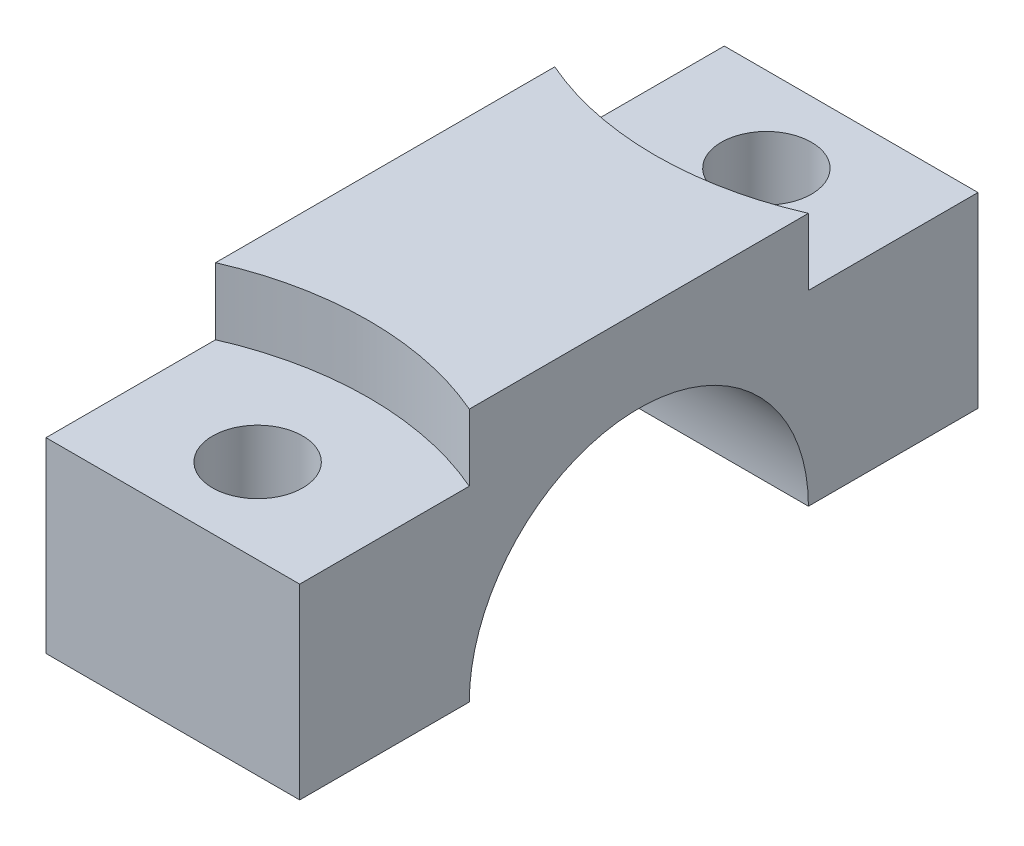
ISO-10303-21;
HEADER;
FILE_DESCRIPTION(('STEP AP214'),'2;1');
FILE_NAME('part.step','',(''),(''),'','','');
FILE_SCHEMA(('AUTOMOTIVE_DESIGN { 1 0 10303 214 1 1 1 1 }'));
ENDSEC;
DATA;
#1=APPLICATION_CONTEXT('core data for automotive mechanical design processes');
#2=APPLICATION_PROTOCOL_DEFINITION('international standard','automotive_design',2000,#1);
#3=PRODUCT_CONTEXT('',#1,'mechanical');
#4=PRODUCT('Part','Part','',(#3));
#5=PRODUCT_RELATED_PRODUCT_CATEGORY('part','',(#4));
#6=PRODUCT_DEFINITION_FORMATION('','',#4);
#7=PRODUCT_DEFINITION_CONTEXT('part definition',#1,'design');
#8=PRODUCT_DEFINITION('design','',#6,#7);
#9=PRODUCT_DEFINITION_SHAPE('','',#8);
#10=(LENGTH_UNIT() NAMED_UNIT(*) SI_UNIT(.MILLI.,.METRE.));
#11=(NAMED_UNIT(*) PLANE_ANGLE_UNIT() SI_UNIT($,.RADIAN.));
#12=(NAMED_UNIT(*) SI_UNIT($,.STERADIAN.) SOLID_ANGLE_UNIT());
#13=UNCERTAINTY_MEASURE_WITH_UNIT(LENGTH_MEASURE(1.E-05),#10,'distance_accuracy_value','');
#14=(GEOMETRIC_REPRESENTATION_CONTEXT(3) GLOBAL_UNCERTAINTY_ASSIGNED_CONTEXT((#13)) GLOBAL_UNIT_ASSIGNED_CONTEXT((#10,
#11,#12)) REPRESENTATION_CONTEXT('',''));
#15=CARTESIAN_POINT('',(0.,0.,0.));
#16=DIRECTION('',(0.,0.,1.));
#17=DIRECTION('',(1.,0.,0.));
#18=AXIS2_PLACEMENT_3D('',#15,#16,#17);
#19=CARTESIAN_POINT('',(0.,-14.,0.));
#20=DIRECTION('',(0.,1.,0.));
#21=DIRECTION('',(0.,0.,1.));
#22=AXIS2_PLACEMENT_3D('',#19,#20,#21);
#23=PLANE('',#22);
#24=CARTESIAN_POINT('',(9.50000000000001,-14.,-6.35));
#25=DIRECTION('',(0.,1.,0.));
#26=DIRECTION('',(0.,0.,1.));
#27=AXIS2_PLACEMENT_3D('',#24,#25,#26);
#28=CIRCLE('',#27,3.375);
#29=CARTESIAN_POINT('',(9.50000000000001,-14.,-2.975));
#30=VERTEX_POINT('',#29);
#31=EDGE_CURVE('E244',#30,#30,#28,.T.);
#32=ORIENTED_EDGE('',*,*,#31,.T.);
#33=EDGE_LOOP('',(#32));
#34=FACE_BOUND('',#33,.T.);
#35=DIRECTION('',(0.,0.,-1.));
#36=VECTOR('',#35,1.);
#37=CARTESIAN_POINT('',(0.,-14.,0.));
#38=LINE('',#37,#36);
#39=CARTESIAN_POINT('',(0.,-14.,0.));
#40=VERTEX_POINT('',#39);
#41=CARTESIAN_POINT('',(0.,-14.,-12.7));
#42=VERTEX_POINT('',#41);
#43=EDGE_CURVE('E208',#40,#42,#38,.T.);
#44=ORIENTED_EDGE('',*,*,#43,.T.);
#45=DIRECTION('',(1.,0.,0.));
#46=VECTOR('',#45,1.);
#47=CARTESIAN_POINT('',(0.,-14.,-12.7));
#48=LINE('',#47,#46);
#49=CARTESIAN_POINT('',(19.,-14.,-12.7));
#50=VERTEX_POINT('',#49);
#51=EDGE_CURVE('E12',#42,#50,#48,.T.);
#52=ORIENTED_EDGE('',*,*,#51,.T.);
#53=DIRECTION('',(0.,0.,-1.));
#54=VECTOR('',#53,1.);
#55=CARTESIAN_POINT('',(19.,-14.,0.));
#56=LINE('',#55,#54);
#57=CARTESIAN_POINT('',(19.,-14.,0.));
#58=VERTEX_POINT('',#57);
#59=EDGE_CURVE('E200',#58,#50,#56,.T.);
#60=ORIENTED_EDGE('',*,*,#59,.F.);
#61=DIRECTION('',(1.,0.,0.));
#62=VECTOR('',#61,1.);
#63=CARTESIAN_POINT('',(0.,-14.,0.));
#64=LINE('',#63,#62);
#65=EDGE_CURVE('E254',#40,#58,#64,.T.);
#66=ORIENTED_EDGE('',*,*,#65,.F.);
#67=EDGE_LOOP('',(#44,#52,#60,#66));
#68=FACE_BOUND('',#67,.T.);
#69=ADVANCED_FACE('F110',(#34,#68),#23,.F.);
#70=CARTESIAN_POINT('',(0.,0.,0.));
#71=DIRECTION('',(0.,1.,0.));
#72=DIRECTION('',(0.,0.,1.));
#73=AXIS2_PLACEMENT_3D('',#70,#71,#72);
#74=PLANE('',#73);
#75=CARTESIAN_POINT('',(9.50000000000001,0.,-6.35));
#76=DIRECTION('',(0.,1.,0.));
#77=DIRECTION('',(0.,0.,1.));
#78=AXIS2_PLACEMENT_3D('',#75,#76,#77);
#79=CIRCLE('',#78,3.375);
#80=CARTESIAN_POINT('',(9.50000000000001,0.,-2.975));
#81=VERTEX_POINT('',#80);
#82=EDGE_CURVE('E249',#81,#81,#79,.T.);
#83=ORIENTED_EDGE('',*,*,#82,.F.);
#84=EDGE_LOOP('',(#83));
#85=FACE_BOUND('',#84,.T.);
#86=CARTESIAN_POINT('',(9.5,0.,9.1108711426206));
#87=DIRECTION('',(0.,1.,0.));
#88=DIRECTION('',(0.,0.,1.));
#89=AXIS2_PLACEMENT_3D('',#86,#87,#88);
#90=CIRCLE('',#89,23.79);
#91=CARTESIAN_POINT('',(0.,0.,-12.7));
#92=VERTEX_POINT('',#91);
#93=CARTESIAN_POINT('',(19.,0.,-12.7));
#94=VERTEX_POINT('',#93);
#95=EDGE_CURVE('E274',#92,#94,#90,.F.);
#96=ORIENTED_EDGE('',*,*,#95,.F.);
#97=DIRECTION('',(0.,0.,-1.));
#98=VECTOR('',#97,1.);
#99=CARTESIAN_POINT('',(0.,0.,0.));
#100=LINE('',#99,#98);
#101=CARTESIAN_POINT('',(0.,0.,0.));
#102=VERTEX_POINT('',#101);
#103=EDGE_CURVE('E226',#102,#92,#100,.T.);
#104=ORIENTED_EDGE('',*,*,#103,.F.);
#105=DIRECTION('',(1.,0.,0.));
#106=VECTOR('',#105,1.);
#107=CARTESIAN_POINT('',(0.,0.,0.));
#108=LINE('',#107,#106);
#109=CARTESIAN_POINT('',(19.,0.,0.));
#110=VERTEX_POINT('',#109);
#111=EDGE_CURVE('E248',#102,#110,#108,.T.);
#112=ORIENTED_EDGE('',*,*,#111,.T.);
#113=DIRECTION('',(0.,0.,-1.));
#114=VECTOR('',#113,1.);
#115=CARTESIAN_POINT('',(19.,0.,0.));
#116=LINE('',#115,#114);
#117=EDGE_CURVE('E231',#110,#94,#116,.T.);
#118=ORIENTED_EDGE('',*,*,#117,.T.);
#119=EDGE_LOOP('',(#96,#104,#112,#118));
#120=FACE_BOUND('',#119,.T.);
#121=ADVANCED_FACE('F272',(#85,#120),#74,.T.);
#122=CARTESIAN_POINT('',(9.50000000000001,0.,-44.45));
#123=DIRECTION('',(0.,1.,0.));
#124=DIRECTION('',(0.,0.,1.));
#125=AXIS2_PLACEMENT_3D('',#122,#123,#124);
#126=CIRCLE('',#125,3.375);
#127=CARTESIAN_POINT('',(9.50000000000001,0.,-41.075));
#128=VERTEX_POINT('',#127);
#129=EDGE_CURVE('E220',#128,#128,#126,.T.);
#130=ORIENTED_EDGE('',*,*,#129,.F.);
#131=EDGE_LOOP('',(#130));
#132=FACE_BOUND('',#131,.T.);
#133=CARTESIAN_POINT('',(0.,0.,-38.1));
#134=VERTEX_POINT('',#133);
#135=CARTESIAN_POINT('',(0.,0.,-50.8));
#136=VERTEX_POINT('',#135);
#137=EDGE_CURVE('E224',#134,#136,#100,.T.);
#138=ORIENTED_EDGE('',*,*,#137,.F.);
#139=CARTESIAN_POINT('',(9.5,0.,-59.9108711426206));
#140=DIRECTION('',(0.,1.,0.));
#141=DIRECTION('',(0.,0.,1.));
#142=AXIS2_PLACEMENT_3D('',#139,#140,#141);
#143=CIRCLE('',#142,23.79);
#144=CARTESIAN_POINT('',(19.,0.,-38.1));
#145=VERTEX_POINT('',#144);
#146=EDGE_CURVE('E134',#134,#145,#143,.T.);
#147=ORIENTED_EDGE('',*,*,#146,.T.);
#148=CARTESIAN_POINT('',(19.,0.,-50.8));
#149=VERTEX_POINT('',#148);
#150=EDGE_CURVE('E230',#145,#149,#116,.T.);
#151=ORIENTED_EDGE('',*,*,#150,.T.);
#152=DIRECTION('',(1.,0.,0.));
#153=VECTOR('',#152,1.);
#154=CARTESIAN_POINT('',(0.,0.,-50.8));
#155=LINE('',#154,#153);
#156=EDGE_CURVE('E234',#136,#149,#155,.T.);
#157=ORIENTED_EDGE('',*,*,#156,.F.);
#158=EDGE_LOOP('',(#138,#147,#151,#157));
#159=FACE_BOUND('',#158,.T.);
#160=ADVANCED_FACE('F323',(#132,#159),#74,.T.);
#161=CARTESIAN_POINT('',(9.50000000000001,-14.,-44.45));
#162=DIRECTION('',(0.,1.,0.));
#163=DIRECTION('',(0.,0.,1.));
#164=AXIS2_PLACEMENT_3D('',#161,#162,#163);
#165=CYLINDRICAL_SURFACE('',#164,3.375);
#166=CARTESIAN_POINT('',(9.50000000000001,-14.,-44.45));
#167=DIRECTION('',(0.,1.,0.));
#168=DIRECTION('',(0.,0.,1.));
#169=AXIS2_PLACEMENT_3D('',#166,#167,#168);
#170=CIRCLE('',#169,3.375);
#171=CARTESIAN_POINT('',(9.50000000000001,-14.,-41.075));
#172=VERTEX_POINT('',#171);
#173=EDGE_CURVE('E238',#172,#172,#170,.T.);
#174=ORIENTED_EDGE('',*,*,#173,.F.);
#175=EDGE_LOOP('',(#174));
#176=FACE_BOUND('',#175,.T.);
#177=ORIENTED_EDGE('',*,*,#129,.T.);
#178=EDGE_LOOP('',(#177));
#179=FACE_BOUND('',#178,.T.);
#180=ADVANCED_FACE('F354',(#176,#179),#165,.F.);
#181=CARTESIAN_POINT('',(0.,-14.,0.));
#182=DIRECTION('',(1.,0.,0.));
#183=DIRECTION('',(0.,0.,-1.));
#184=AXIS2_PLACEMENT_3D('',#181,#182,#183);
#185=PLANE('',#184);
#186=CARTESIAN_POINT('',(0.,-14.,-38.1));
#187=VERTEX_POINT('',#186);
#188=CARTESIAN_POINT('',(0.,-14.,-50.8));
#189=VERTEX_POINT('',#188);
#190=EDGE_CURVE('E213',#187,#189,#38,.T.);
#191=ORIENTED_EDGE('',*,*,#190,.F.);
#192=CARTESIAN_POINT('',(0.,-14.,-25.4));
#193=DIRECTION('',(1.,0.,0.));
#194=DIRECTION('',(0.,0.,-1.));
#195=AXIS2_PLACEMENT_3D('',#192,#193,#194);
#196=CIRCLE('',#195,12.7);
#197=EDGE_CURVE('E126',#187,#42,#196,.T.);
#198=ORIENTED_EDGE('',*,*,#197,.T.);
#199=ORIENTED_EDGE('',*,*,#43,.F.);
#200=DIRECTION('',(0.,1.,0.));
#201=VECTOR('',#200,1.);
#202=CARTESIAN_POINT('',(0.,-14.,0.));
#203=LINE('',#202,#201);
#204=EDGE_CURVE('E258',#40,#102,#203,.T.);
#205=ORIENTED_EDGE('',*,*,#204,.T.);
#206=ORIENTED_EDGE('',*,*,#103,.T.);
#207=DIRECTION('',(0.,-1.,0.));
#208=VECTOR('',#207,1.);
#209=CARTESIAN_POINT('',(0.,5.,-12.7));
#210=LINE('',#209,#208);
#211=CARTESIAN_POINT('',(0.,5.,-12.7));
#212=VERTEX_POINT('',#211);
#213=EDGE_CURVE('E253',#212,#92,#210,.T.);
#214=ORIENTED_EDGE('',*,*,#213,.F.);
#215=DIRECTION('',(0.,0.,-1.));
#216=VECTOR('',#215,1.);
#217=CARTESIAN_POINT('',(0.,5.,0.));
#218=LINE('',#217,#216);
#219=CARTESIAN_POINT('',(0.,5.,-38.1));
#220=VERTEX_POINT('',#219);
#221=EDGE_CURVE('E285',#212,#220,#218,.T.);
#222=ORIENTED_EDGE('',*,*,#221,.T.);
#223=DIRECTION('',(0.,-1.,0.));
#224=VECTOR('',#223,1.);
#225=CARTESIAN_POINT('',(0.,5.,-38.1));
#226=LINE('',#225,#224);
#227=EDGE_CURVE('E298',#220,#134,#226,.T.);
#228=ORIENTED_EDGE('',*,*,#227,.T.);
#229=ORIENTED_EDGE('',*,*,#137,.T.);
#230=DIRECTION('',(0.,1.,0.));
#231=VECTOR('',#230,1.);
#232=CARTESIAN_POINT('',(0.,-14.,-50.8));
#233=LINE('',#232,#231);
#234=EDGE_CURVE('E192',#189,#136,#233,.T.);
#235=ORIENTED_EDGE('',*,*,#234,.F.);
#236=EDGE_LOOP('',(#191,#198,#199,#205,#206,#214,#222,#228,#229,#235));
#237=FACE_BOUND('',#236,.T.);
#238=ADVANCED_FACE('F277',(#237),#185,.F.);
#239=CARTESIAN_POINT('',(19.,-14.,0.));
#240=DIRECTION('',(1.,0.,0.));
#241=DIRECTION('',(0.,0.,-1.));
#242=AXIS2_PLACEMENT_3D('',#239,#240,#241);
#243=PLANE('',#242);
#244=CARTESIAN_POINT('',(19.,-14.,-25.4));
#245=DIRECTION('',(1.,0.,0.));
#246=DIRECTION('',(0.,0.,-1.));
#247=AXIS2_PLACEMENT_3D('',#244,#245,#246);
#248=CIRCLE('',#247,12.7);
#249=CARTESIAN_POINT('',(19.,-14.,-38.1));
#250=VERTEX_POINT('',#249);
#251=EDGE_CURVE('E187',#250,#50,#248,.T.);
#252=ORIENTED_EDGE('',*,*,#251,.F.);
#253=CARTESIAN_POINT('',(19.,-14.,-50.8));
#254=VERTEX_POINT('',#253);
#255=EDGE_CURVE('E197',#250,#254,#56,.T.);
#256=ORIENTED_EDGE('',*,*,#255,.T.);
#257=DIRECTION('',(0.,1.,0.));
#258=VECTOR('',#257,1.);
#259=CARTESIAN_POINT('',(19.,-14.,-50.8));
#260=LINE('',#259,#258);
#261=EDGE_CURVE('E219',#254,#149,#260,.T.);
#262=ORIENTED_EDGE('',*,*,#261,.T.);
#263=ORIENTED_EDGE('',*,*,#150,.F.);
#264=DIRECTION('',(0.,-1.,0.));
#265=VECTOR('',#264,1.);
#266=CARTESIAN_POINT('',(19.,5.,-38.1));
#267=LINE('',#266,#265);
#268=CARTESIAN_POINT('',(19.,5.,-38.1));
#269=VERTEX_POINT('',#268);
#270=EDGE_CURVE('E305',#269,#145,#267,.T.);
#271=ORIENTED_EDGE('',*,*,#270,.F.);
#272=DIRECTION('',(0.,0.,-1.));
#273=VECTOR('',#272,1.);
#274=CARTESIAN_POINT('',(19.,5.,0.));
#275=LINE('',#274,#273);
#276=CARTESIAN_POINT('',(19.,5.,-12.7));
#277=VERTEX_POINT('',#276);
#278=EDGE_CURVE('E292',#277,#269,#275,.T.);
#279=ORIENTED_EDGE('',*,*,#278,.F.);
#280=DIRECTION('',(0.,-1.,0.));
#281=VECTOR('',#280,1.);
#282=CARTESIAN_POINT('',(19.,5.,-12.7));
#283=LINE('',#282,#281);
#284=EDGE_CURVE('E309',#277,#94,#283,.T.);
#285=ORIENTED_EDGE('',*,*,#284,.T.);
#286=ORIENTED_EDGE('',*,*,#117,.F.);
#287=DIRECTION('',(0.,1.,0.));
#288=VECTOR('',#287,1.);
#289=CARTESIAN_POINT('',(19.,-14.,0.));
#290=LINE('',#289,#288);
#291=EDGE_CURVE('E225',#58,#110,#290,.T.);
#292=ORIENTED_EDGE('',*,*,#291,.F.);
#293=ORIENTED_EDGE('',*,*,#59,.T.);
#294=EDGE_LOOP('',(#252,#256,#262,#263,#271,#279,#285,#286,#292,#293));
#295=FACE_BOUND('',#294,.T.);
#296=ADVANCED_FACE('F195',(#295),#243,.T.);
#297=CARTESIAN_POINT('',(0.,-14.,-50.8));
#298=DIRECTION('',(0.,0.,1.));
#299=DIRECTION('',(1.,0.,0.));
#300=AXIS2_PLACEMENT_3D('',#297,#298,#299);
#301=PLANE('',#300);
#302=ORIENTED_EDGE('',*,*,#156,.T.);
#303=ORIENTED_EDGE('',*,*,#261,.F.);
#304=DIRECTION('',(1.,0.,0.));
#305=VECTOR('',#304,1.);
#306=CARTESIAN_POINT('',(0.,-14.,-50.8));
#307=LINE('',#306,#305);
#308=EDGE_CURVE('E205',#189,#254,#307,.T.);
#309=ORIENTED_EDGE('',*,*,#308,.F.);
#310=ORIENTED_EDGE('',*,*,#234,.T.);
#311=EDGE_LOOP('',(#302,#303,#309,#310));
#312=FACE_BOUND('',#311,.T.);
#313=ADVANCED_FACE('F320',(#312),#301,.F.);
#314=ORIENTED_EDGE('',*,*,#173,.T.);
#315=EDGE_LOOP('',(#314));
#316=FACE_BOUND('',#315,.T.);
#317=ORIENTED_EDGE('',*,*,#255,.F.);
#318=DIRECTION('',(1.,0.,0.));
#319=VECTOR('',#318,1.);
#320=CARTESIAN_POINT('',(0.,-14.,-38.1));
#321=LINE('',#320,#319);
#322=EDGE_CURVE('E119',#250,#187,#321,.F.);
#323=ORIENTED_EDGE('',*,*,#322,.T.);
#324=ORIENTED_EDGE('',*,*,#190,.T.);
#325=ORIENTED_EDGE('',*,*,#308,.T.);
#326=EDGE_LOOP('',(#317,#323,#324,#325));
#327=FACE_BOUND('',#326,.T.);
#328=ADVANCED_FACE('F203',(#316,#327),#23,.F.);
#329=CARTESIAN_POINT('',(0.,-14.,0.));
#330=DIRECTION('',(0.,0.,1.));
#331=DIRECTION('',(1.,0.,0.));
#332=AXIS2_PLACEMENT_3D('',#329,#330,#331);
#333=PLANE('',#332);
#334=ORIENTED_EDGE('',*,*,#111,.F.);
#335=ORIENTED_EDGE('',*,*,#204,.F.);
#336=ORIENTED_EDGE('',*,*,#65,.T.);
#337=ORIENTED_EDGE('',*,*,#291,.T.);
#338=EDGE_LOOP('',(#334,#335,#336,#337));
#339=FACE_BOUND('',#338,.T.);
#340=ADVANCED_FACE('F112',(#339),#333,.T.);
#341=CARTESIAN_POINT('',(9.50000000000001,-14.,-6.35));
#342=DIRECTION('',(0.,1.,0.));
#343=DIRECTION('',(0.,0.,1.));
#344=AXIS2_PLACEMENT_3D('',#341,#342,#343);
#345=CYLINDRICAL_SURFACE('',#344,3.375);
#346=ORIENTED_EDGE('',*,*,#31,.F.);
#347=EDGE_LOOP('',(#346));
#348=FACE_BOUND('',#347,.T.);
#349=ORIENTED_EDGE('',*,*,#82,.T.);
#350=EDGE_LOOP('',(#349));
#351=FACE_BOUND('',#350,.T.);
#352=ADVANCED_FACE('F338',(#348,#351),#345,.F.);
#353=CARTESIAN_POINT('',(9.5,5.,9.1108711426206));
#354=DIRECTION('',(0.,-1.,0.));
#355=DIRECTION('',(0.,0.,-1.));
#356=AXIS2_PLACEMENT_3D('',#353,#354,#355);
#357=CYLINDRICAL_SURFACE('',#356,23.79);
#358=ORIENTED_EDGE('',*,*,#95,.T.);
#359=ORIENTED_EDGE('',*,*,#284,.F.);
#360=CARTESIAN_POINT('',(9.5,5.,9.1108711426206));
#361=DIRECTION('',(0.,1.,0.));
#362=DIRECTION('',(0.,0.,1.));
#363=AXIS2_PLACEMENT_3D('',#360,#361,#362);
#364=CIRCLE('',#363,23.79);
#365=EDGE_CURVE('E289',#212,#277,#364,.F.);
#366=ORIENTED_EDGE('',*,*,#365,.F.);
#367=ORIENTED_EDGE('',*,*,#213,.T.);
#368=EDGE_LOOP('',(#358,#359,#366,#367));
#369=FACE_BOUND('',#368,.T.);
#370=ADVANCED_FACE('F336',(#369),#357,.F.);
#371=CARTESIAN_POINT('',(9.5,5.,-59.9108711426206));
#372=DIRECTION('',(0.,-1.,0.));
#373=DIRECTION('',(0.,0.,-1.));
#374=AXIS2_PLACEMENT_3D('',#371,#372,#373);
#375=CYLINDRICAL_SURFACE('',#374,23.79);
#376=ORIENTED_EDGE('',*,*,#146,.F.);
#377=ORIENTED_EDGE('',*,*,#227,.F.);
#378=CARTESIAN_POINT('',(9.5,5.,-59.9108711426206));
#379=DIRECTION('',(0.,1.,0.));
#380=DIRECTION('',(0.,0.,1.));
#381=AXIS2_PLACEMENT_3D('',#378,#379,#380);
#382=CIRCLE('',#381,23.79);
#383=EDGE_CURVE('E295',#220,#269,#382,.T.);
#384=ORIENTED_EDGE('',*,*,#383,.T.);
#385=ORIENTED_EDGE('',*,*,#270,.T.);
#386=EDGE_LOOP('',(#376,#377,#384,#385));
#387=FACE_BOUND('',#386,.T.);
#388=ADVANCED_FACE('F328',(#387),#375,.F.);
#389=CARTESIAN_POINT('',(0.,5.,0.));
#390=DIRECTION('',(0.,1.,0.));
#391=DIRECTION('',(0.,0.,1.));
#392=AXIS2_PLACEMENT_3D('',#389,#390,#391);
#393=PLANE('',#392);
#394=ORIENTED_EDGE('',*,*,#221,.F.);
#395=ORIENTED_EDGE('',*,*,#365,.T.);
#396=ORIENTED_EDGE('',*,*,#278,.T.);
#397=ORIENTED_EDGE('',*,*,#383,.F.);
#398=EDGE_LOOP('',(#394,#395,#396,#397));
#399=FACE_BOUND('',#398,.T.);
#400=ADVANCED_FACE('F332',(#399),#393,.T.);
#401=CARTESIAN_POINT('',(0.,-14.,-25.4));
#402=DIRECTION('',(1.,0.,0.));
#403=DIRECTION('',(0.,0.,-1.));
#404=AXIS2_PLACEMENT_3D('',#401,#402,#403);
#405=CYLINDRICAL_SURFACE('',#404,12.7);
#406=ORIENTED_EDGE('',*,*,#197,.F.);
#407=ORIENTED_EDGE('',*,*,#322,.F.);
#408=ORIENTED_EDGE('',*,*,#251,.T.);
#409=ORIENTED_EDGE('',*,*,#51,.F.);
#410=EDGE_LOOP('',(#406,#407,#408,#409));
#411=FACE_BOUND('',#410,.T.);
#412=ADVANCED_FACE('F186',(#411),#405,.F.);
#413=CLOSED_SHELL('',(#69,#121,#160,#180,#238,#296,#313,#328,#340,#352,#370,#388,#400,#412));
#414=MANIFOLD_SOLID_BREP('B2',#413);
#415=ADVANCED_BREP_SHAPE_REPRESENTATION('',(#18,#414),#14);
#416=SHAPE_DEFINITION_REPRESENTATION(#9,#415);
ENDSEC;
END-ISO-10303-21;
